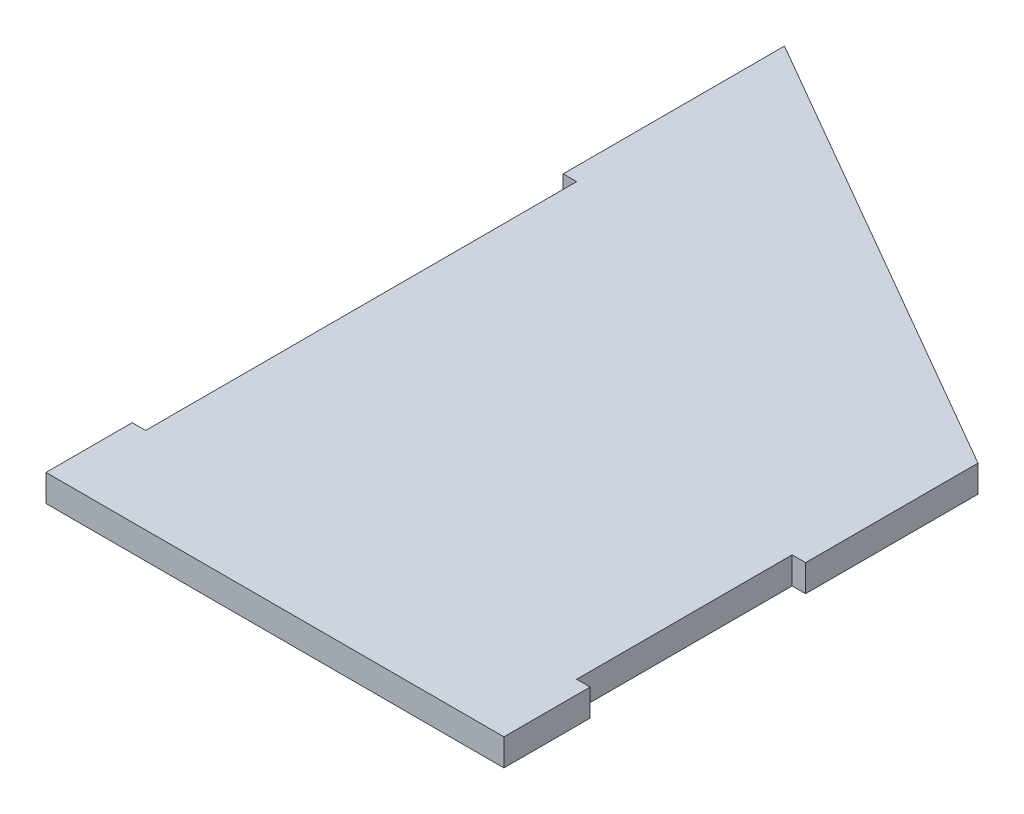
ISO-10303-21;
HEADER;
FILE_DESCRIPTION(('STEP AP214'),'2;1');
FILE_NAME('part.step','',(''),(''),'','','');
FILE_SCHEMA(('AUTOMOTIVE_DESIGN { 1 0 10303 214 1 1 1 1 }'));
ENDSEC;
DATA;
#1=APPLICATION_CONTEXT('core data for automotive mechanical design processes');
#2=APPLICATION_PROTOCOL_DEFINITION('international standard','automotive_design',2000,#1);
#3=PRODUCT_CONTEXT('',#1,'mechanical');
#4=PRODUCT('Part','Part','',(#3));
#5=PRODUCT_RELATED_PRODUCT_CATEGORY('part','',(#4));
#6=PRODUCT_DEFINITION_FORMATION('','',#4);
#7=PRODUCT_DEFINITION_CONTEXT('part definition',#1,'design');
#8=PRODUCT_DEFINITION('design','',#6,#7);
#9=PRODUCT_DEFINITION_SHAPE('','',#8);
#10=(LENGTH_UNIT() NAMED_UNIT(*) SI_UNIT(.MILLI.,.METRE.));
#11=(NAMED_UNIT(*) PLANE_ANGLE_UNIT() SI_UNIT($,.RADIAN.));
#12=(NAMED_UNIT(*) SI_UNIT($,.STERADIAN.) SOLID_ANGLE_UNIT());
#13=UNCERTAINTY_MEASURE_WITH_UNIT(LENGTH_MEASURE(1.E-05),#10,'distance_accuracy_value','');
#14=(GEOMETRIC_REPRESENTATION_CONTEXT(3) GLOBAL_UNCERTAINTY_ASSIGNED_CONTEXT((#13)) GLOBAL_UNIT_ASSIGNED_CONTEXT((#10,
#11,#12)) REPRESENTATION_CONTEXT('',''));
#15=CARTESIAN_POINT('',(0.,0.,0.));
#16=DIRECTION('',(0.,0.,1.));
#17=DIRECTION('',(1.,0.,0.));
#18=AXIS2_PLACEMENT_3D('',#15,#16,#17);
#19=CARTESIAN_POINT('',(0.,1.5875,-3.81));
#20=DIRECTION('',(0.,0.,1.));
#21=DIRECTION('',(1.,0.,0.));
#22=AXIS2_PLACEMENT_3D('',#19,#20,#21);
#23=PLANE('',#22);
#24=DIRECTION('',(-1.,0.,0.));
#25=VECTOR('',#24,1.);
#26=CARTESIAN_POINT('',(0.,0.,-3.81));
#27=LINE('',#26,#25);
#28=CARTESIAN_POINT('',(13.49375,0.,-3.81));
#29=VERTEX_POINT('',#28);
#30=CARTESIAN_POINT('',(12.7,0.,-3.81));
#31=VERTEX_POINT('',#30);
#32=EDGE_CURVE('E160',#29,#31,#27,.T.);
#33=ORIENTED_EDGE('',*,*,#32,.F.);
#34=DIRECTION('',(0.,-1.,0.));
#35=VECTOR('',#34,1.);
#36=CARTESIAN_POINT('',(13.49375,1.5875,-3.81));
#37=LINE('',#36,#35);
#38=CARTESIAN_POINT('',(13.49375,1.5875,-3.81));
#39=VERTEX_POINT('',#38);
#40=EDGE_CURVE('E11',#39,#29,#37,.T.);
#41=ORIENTED_EDGE('',*,*,#40,.F.);
#42=DIRECTION('',(-1.,0.,0.));
#43=VECTOR('',#42,1.);
#44=CARTESIAN_POINT('',(0.,1.5875,-3.81));
#45=LINE('',#44,#43);
#46=CARTESIAN_POINT('',(12.7,1.5875,-3.81));
#47=VERTEX_POINT('',#46);
#48=EDGE_CURVE('E189',#39,#47,#45,.T.);
#49=ORIENTED_EDGE('',*,*,#48,.T.);
#50=DIRECTION('',(0.,-1.,0.));
#51=VECTOR('',#50,1.);
#52=CARTESIAN_POINT('',(12.7,1.5875,-3.81));
#53=LINE('',#52,#51);
#54=EDGE_CURVE('E103',#47,#31,#53,.T.);
#55=ORIENTED_EDGE('',*,*,#54,.T.);
#56=EDGE_LOOP('',(#33,#41,#49,#55));
#57=FACE_BOUND('',#56,.T.);
#58=ADVANCED_FACE('F40',(#57),#23,.T.);
#59=CARTESIAN_POINT('',(13.49375,1.5875,0.));
#60=DIRECTION('',(-1.,0.,0.));
#61=DIRECTION('',(0.,0.,1.));
#62=AXIS2_PLACEMENT_3D('',#59,#60,#61);
#63=PLANE('',#62);
#64=DIRECTION('',(0.,0.,-1.));
#65=VECTOR('',#64,1.);
#66=CARTESIAN_POINT('',(13.49375,0.,0.));
#67=LINE('',#66,#65);
#68=CARTESIAN_POINT('',(13.49375,0.,-13.97));
#69=VERTEX_POINT('',#68);
#70=EDGE_CURVE('E163',#29,#69,#67,.T.);
#71=ORIENTED_EDGE('',*,*,#70,.T.);
#72=DIRECTION('',(0.,-1.,0.));
#73=VECTOR('',#72,1.);
#74=CARTESIAN_POINT('',(13.49375,1.5875,-13.97));
#75=LINE('',#74,#73);
#76=CARTESIAN_POINT('',(13.49375,1.5875,-13.97));
#77=VERTEX_POINT('',#76);
#78=EDGE_CURVE('E48',#77,#69,#75,.T.);
#79=ORIENTED_EDGE('',*,*,#78,.F.);
#80=DIRECTION('',(0.,0.,-1.));
#81=VECTOR('',#80,1.);
#82=CARTESIAN_POINT('',(13.49375,1.5875,0.));
#83=LINE('',#82,#81);
#84=EDGE_CURVE('E146',#39,#77,#83,.T.);
#85=ORIENTED_EDGE('',*,*,#84,.F.);
#86=ORIENTED_EDGE('',*,*,#40,.T.);
#87=EDGE_LOOP('',(#71,#79,#85,#86));
#88=FACE_BOUND('',#87,.T.);
#89=ADVANCED_FACE('F213',(#88),#63,.F.);
#90=CARTESIAN_POINT('',(9.42262494543433,1.5875,-16.3204651461581));
#91=DIRECTION('',(0.500000000000001,0.,-0.866025403784438));
#92=DIRECTION('',(-0.866025403784438,0.,-0.500000000000001));
#93=AXIS2_PLACEMENT_3D('',#90,#91,#92);
#94=PLANE('',#93);
#95=DIRECTION('',(0.866025403784438,0.,0.500000000000001));
#96=VECTOR('',#95,1.);
#97=CARTESIAN_POINT('',(9.42262494543433,0.,-16.3204651461581));
#98=LINE('',#97,#96);
#99=CARTESIAN_POINT('',(-13.49375,0.,-29.5512403897551));
#100=VERTEX_POINT('',#99);
#101=EDGE_CURVE('E166',#100,#69,#98,.T.);
#102=ORIENTED_EDGE('',*,*,#101,.F.);
#103=DIRECTION('',(0.,-1.,0.));
#104=VECTOR('',#103,1.);
#105=CARTESIAN_POINT('',(-13.49375,1.5875,-29.5512403897551));
#106=LINE('',#105,#104);
#107=CARTESIAN_POINT('',(-13.49375,1.5875,-29.5512403897551));
#108=VERTEX_POINT('',#107);
#109=EDGE_CURVE('E203',#108,#100,#106,.T.);
#110=ORIENTED_EDGE('',*,*,#109,.F.);
#111=DIRECTION('',(0.866025403784438,0.,0.500000000000001));
#112=VECTOR('',#111,1.);
#113=CARTESIAN_POINT('',(9.42262494543433,1.5875,-16.3204651461581));
#114=LINE('',#113,#112);
#115=EDGE_CURVE('E210',#108,#77,#114,.T.);
#116=ORIENTED_EDGE('',*,*,#115,.T.);
#117=ORIENTED_EDGE('',*,*,#78,.T.);
#118=EDGE_LOOP('',(#102,#110,#116,#117));
#119=FACE_BOUND('',#118,.T.);
#120=ADVANCED_FACE('F208',(#119),#94,.T.);
#121=CARTESIAN_POINT('',(-13.49375,1.5875,0.));
#122=DIRECTION('',(-1.,0.,0.));
#123=DIRECTION('',(0.,0.,1.));
#124=AXIS2_PLACEMENT_3D('',#121,#122,#123);
#125=PLANE('',#124);
#126=DIRECTION('',(0.,0.,-1.));
#127=VECTOR('',#126,1.);
#128=CARTESIAN_POINT('',(-13.49375,0.,0.));
#129=LINE('',#128,#127);
#130=CARTESIAN_POINT('',(-13.49375,0.,-16.51));
#131=VERTEX_POINT('',#130);
#132=EDGE_CURVE('E169',#131,#100,#129,.T.);
#133=ORIENTED_EDGE('',*,*,#132,.F.);
#134=DIRECTION('',(0.,-1.,0.));
#135=VECTOR('',#134,1.);
#136=CARTESIAN_POINT('',(-13.49375,1.5875,-16.51));
#137=LINE('',#136,#135);
#138=CARTESIAN_POINT('',(-13.49375,1.5875,-16.51));
#139=VERTEX_POINT('',#138);
#140=EDGE_CURVE('E201',#139,#131,#137,.T.);
#141=ORIENTED_EDGE('',*,*,#140,.F.);
#142=DIRECTION('',(0.,0.,-1.));
#143=VECTOR('',#142,1.);
#144=CARTESIAN_POINT('',(-13.49375,1.5875,0.));
#145=LINE('',#144,#143);
#146=EDGE_CURVE('E223',#139,#108,#145,.T.);
#147=ORIENTED_EDGE('',*,*,#146,.T.);
#148=ORIENTED_EDGE('',*,*,#109,.T.);
#149=EDGE_LOOP('',(#133,#141,#147,#148));
#150=FACE_BOUND('',#149,.T.);
#151=ADVANCED_FACE('F219',(#150),#125,.T.);
#152=CARTESIAN_POINT('',(0.,1.5875,-16.51));
#153=DIRECTION('',(0.,0.,-1.));
#154=DIRECTION('',(-1.,0.,0.));
#155=AXIS2_PLACEMENT_3D('',#152,#153,#154);
#156=PLANE('',#155);
#157=DIRECTION('',(1.,0.,0.));
#158=VECTOR('',#157,1.);
#159=CARTESIAN_POINT('',(0.,0.,-16.51));
#160=LINE('',#159,#158);
#161=CARTESIAN_POINT('',(-12.7,0.,-16.51));
#162=VERTEX_POINT('',#161);
#163=EDGE_CURVE('E172',#131,#162,#160,.T.);
#164=ORIENTED_EDGE('',*,*,#163,.T.);
#165=DIRECTION('',(0.,-1.,0.));
#166=VECTOR('',#165,1.);
#167=CARTESIAN_POINT('',(-12.7,1.5875,-16.51));
#168=LINE('',#167,#166);
#169=CARTESIAN_POINT('',(-12.7,1.5875,-16.51));
#170=VERTEX_POINT('',#169);
#171=EDGE_CURVE('E199',#170,#162,#168,.T.);
#172=ORIENTED_EDGE('',*,*,#171,.F.);
#173=DIRECTION('',(1.,0.,0.));
#174=VECTOR('',#173,1.);
#175=CARTESIAN_POINT('',(0.,1.5875,-16.51));
#176=LINE('',#175,#174);
#177=EDGE_CURVE('E225',#139,#170,#176,.T.);
#178=ORIENTED_EDGE('',*,*,#177,.F.);
#179=ORIENTED_EDGE('',*,*,#140,.T.);
#180=EDGE_LOOP('',(#164,#172,#178,#179));
#181=FACE_BOUND('',#180,.T.);
#182=ADVANCED_FACE('F326',(#181),#156,.F.);
#183=CARTESIAN_POINT('',(-12.7,1.5875,0.));
#184=DIRECTION('',(-1.,0.,0.));
#185=DIRECTION('',(0.,0.,1.));
#186=AXIS2_PLACEMENT_3D('',#183,#184,#185);
#187=PLANE('',#186);
#188=DIRECTION('',(0.,0.,-1.));
#189=VECTOR('',#188,1.);
#190=CARTESIAN_POINT('',(-12.7,0.,0.));
#191=LINE('',#190,#189);
#192=CARTESIAN_POINT('',(-12.7,0.,8.89));
#193=VERTEX_POINT('',#192);
#194=EDGE_CURVE('E175',#193,#162,#191,.T.);
#195=ORIENTED_EDGE('',*,*,#194,.F.);
#196=DIRECTION('',(0.,-1.,0.));
#197=VECTOR('',#196,1.);
#198=CARTESIAN_POINT('',(-12.7,1.5875,8.89));
#199=LINE('',#198,#197);
#200=CARTESIAN_POINT('',(-12.7,1.5875,8.89));
#201=VERTEX_POINT('',#200);
#202=EDGE_CURVE('E197',#201,#193,#199,.T.);
#203=ORIENTED_EDGE('',*,*,#202,.F.);
#204=DIRECTION('',(0.,0.,-1.));
#205=VECTOR('',#204,1.);
#206=CARTESIAN_POINT('',(-12.7,1.5875,0.));
#207=LINE('',#206,#205);
#208=EDGE_CURVE('E230',#201,#170,#207,.T.);
#209=ORIENTED_EDGE('',*,*,#208,.T.);
#210=ORIENTED_EDGE('',*,*,#171,.T.);
#211=EDGE_LOOP('',(#195,#203,#209,#210));
#212=FACE_BOUND('',#211,.T.);
#213=ADVANCED_FACE('F317',(#212),#187,.T.);
#214=CARTESIAN_POINT('',(0.,1.5875,8.89));
#215=DIRECTION('',(0.,0.,-1.));
#216=DIRECTION('',(-1.,0.,0.));
#217=AXIS2_PLACEMENT_3D('',#214,#215,#216);
#218=PLANE('',#217);
#219=DIRECTION('',(1.,0.,0.));
#220=VECTOR('',#219,1.);
#221=CARTESIAN_POINT('',(0.,0.,8.89));
#222=LINE('',#221,#220);
#223=CARTESIAN_POINT('',(-13.49375,0.,8.89));
#224=VERTEX_POINT('',#223);
#225=EDGE_CURVE('E178',#224,#193,#222,.T.);
#226=ORIENTED_EDGE('',*,*,#225,.F.);
#227=DIRECTION('',(0.,-1.,0.));
#228=VECTOR('',#227,1.);
#229=CARTESIAN_POINT('',(-13.49375,1.5875,8.89));
#230=LINE('',#229,#228);
#231=CARTESIAN_POINT('',(-13.49375,1.5875,8.89));
#232=VERTEX_POINT('',#231);
#233=EDGE_CURVE('E195',#232,#224,#230,.T.);
#234=ORIENTED_EDGE('',*,*,#233,.F.);
#235=DIRECTION('',(1.,0.,0.));
#236=VECTOR('',#235,1.);
#237=CARTESIAN_POINT('',(0.,1.5875,8.89));
#238=LINE('',#237,#236);
#239=EDGE_CURVE('E233',#232,#201,#238,.T.);
#240=ORIENTED_EDGE('',*,*,#239,.T.);
#241=ORIENTED_EDGE('',*,*,#202,.T.);
#242=EDGE_LOOP('',(#226,#234,#240,#241));
#243=FACE_BOUND('',#242,.T.);
#244=ADVANCED_FACE('F244',(#243),#218,.T.);
#245=CARTESIAN_POINT('',(-13.49375,1.5875,0.));
#246=DIRECTION('',(-1.,0.,0.));
#247=DIRECTION('',(0.,0.,1.));
#248=AXIS2_PLACEMENT_3D('',#245,#246,#247);
#249=PLANE('',#248);
#250=DIRECTION('',(0.,0.,-1.));
#251=VECTOR('',#250,1.);
#252=CARTESIAN_POINT('',(-13.49375,0.,0.));
#253=LINE('',#252,#251);
#254=CARTESIAN_POINT('',(-13.49375,0.,13.97));
#255=VERTEX_POINT('',#254);
#256=EDGE_CURVE('E181',#255,#224,#253,.T.);
#257=ORIENTED_EDGE('',*,*,#256,.F.);
#258=DIRECTION('',(0.,-1.,0.));
#259=VECTOR('',#258,1.);
#260=CARTESIAN_POINT('',(-13.49375,1.5875,13.97));
#261=LINE('',#260,#259);
#262=CARTESIAN_POINT('',(-13.49375,1.5875,13.97));
#263=VERTEX_POINT('',#262);
#264=EDGE_CURVE('E193',#263,#255,#261,.T.);
#265=ORIENTED_EDGE('',*,*,#264,.F.);
#266=DIRECTION('',(0.,0.,-1.));
#267=VECTOR('',#266,1.);
#268=CARTESIAN_POINT('',(-13.49375,1.5875,0.));
#269=LINE('',#268,#267);
#270=EDGE_CURVE('E235',#263,#232,#269,.T.);
#271=ORIENTED_EDGE('',*,*,#270,.T.);
#272=ORIENTED_EDGE('',*,*,#233,.T.);
#273=EDGE_LOOP('',(#257,#265,#271,#272));
#274=FACE_BOUND('',#273,.T.);
#275=ADVANCED_FACE('F239',(#274),#249,.T.);
#276=CARTESIAN_POINT('',(0.,1.5875,13.97));
#277=DIRECTION('',(0.,0.,-1.));
#278=DIRECTION('',(-1.,0.,0.));
#279=AXIS2_PLACEMENT_3D('',#276,#277,#278);
#280=PLANE('',#279);
#281=DIRECTION('',(1.,0.,0.));
#282=VECTOR('',#281,1.);
#283=CARTESIAN_POINT('',(0.,0.,13.97));
#284=LINE('',#283,#282);
#285=CARTESIAN_POINT('',(13.49375,0.,13.97));
#286=VERTEX_POINT('',#285);
#287=EDGE_CURVE('E184',#255,#286,#284,.T.);
#288=ORIENTED_EDGE('',*,*,#287,.T.);
#289=DIRECTION('',(0.,-1.,0.));
#290=VECTOR('',#289,1.);
#291=CARTESIAN_POINT('',(13.49375,1.5875,13.97));
#292=LINE('',#291,#290);
#293=CARTESIAN_POINT('',(13.49375,1.5875,13.97));
#294=VERTEX_POINT('',#293);
#295=EDGE_CURVE('E151',#294,#286,#292,.T.);
#296=ORIENTED_EDGE('',*,*,#295,.F.);
#297=DIRECTION('',(1.,0.,0.));
#298=VECTOR('',#297,1.);
#299=CARTESIAN_POINT('',(0.,1.5875,13.97));
#300=LINE('',#299,#298);
#301=EDGE_CURVE('E141',#263,#294,#300,.T.);
#302=ORIENTED_EDGE('',*,*,#301,.F.);
#303=ORIENTED_EDGE('',*,*,#264,.T.);
#304=EDGE_LOOP('',(#288,#296,#302,#303));
#305=FACE_BOUND('',#304,.T.);
#306=ADVANCED_FACE('F248',(#305),#280,.F.);
#307=CARTESIAN_POINT('',(13.49375,0.,8.89));
#308=VERTEX_POINT('',#307);
#309=EDGE_CURVE('E150',#286,#308,#67,.T.);
#310=ORIENTED_EDGE('',*,*,#309,.T.);
#311=DIRECTION('',(0.,-1.,0.));
#312=VECTOR('',#311,1.);
#313=CARTESIAN_POINT('',(13.49375,1.5875,8.89));
#314=LINE('',#313,#312);
#315=CARTESIAN_POINT('',(13.49375,1.5875,8.89));
#316=VERTEX_POINT('',#315);
#317=EDGE_CURVE('E147',#316,#308,#314,.T.);
#318=ORIENTED_EDGE('',*,*,#317,.F.);
#319=EDGE_CURVE('E134',#294,#316,#83,.T.);
#320=ORIENTED_EDGE('',*,*,#319,.F.);
#321=ORIENTED_EDGE('',*,*,#295,.T.);
#322=EDGE_LOOP('',(#310,#318,#320,#321));
#323=FACE_BOUND('',#322,.T.);
#324=ADVANCED_FACE('F148',(#323),#63,.F.);
#325=CARTESIAN_POINT('',(0.,1.5875,8.89));
#326=DIRECTION('',(0.,0.,1.));
#327=DIRECTION('',(1.,0.,0.));
#328=AXIS2_PLACEMENT_3D('',#325,#326,#327);
#329=PLANE('',#328);
#330=DIRECTION('',(-1.,0.,0.));
#331=VECTOR('',#330,1.);
#332=CARTESIAN_POINT('',(0.,0.,8.89));
#333=LINE('',#332,#331);
#334=CARTESIAN_POINT('',(12.7,0.,8.89));
#335=VERTEX_POINT('',#334);
#336=EDGE_CURVE('E96',#308,#335,#333,.T.);
#337=ORIENTED_EDGE('',*,*,#336,.T.);
#338=DIRECTION('',(0.,-1.,0.));
#339=VECTOR('',#338,1.);
#340=CARTESIAN_POINT('',(12.7,1.5875,8.89));
#341=LINE('',#340,#339);
#342=CARTESIAN_POINT('',(12.7,1.5875,8.89));
#343=VERTEX_POINT('',#342);
#344=EDGE_CURVE('E152',#343,#335,#341,.T.);
#345=ORIENTED_EDGE('',*,*,#344,.F.);
#346=DIRECTION('',(-1.,0.,0.));
#347=VECTOR('',#346,1.);
#348=CARTESIAN_POINT('',(0.,1.5875,8.89));
#349=LINE('',#348,#347);
#350=EDGE_CURVE('E138',#316,#343,#349,.T.);
#351=ORIENTED_EDGE('',*,*,#350,.F.);
#352=ORIENTED_EDGE('',*,*,#317,.T.);
#353=EDGE_LOOP('',(#337,#345,#351,#352));
#354=FACE_BOUND('',#353,.T.);
#355=ADVANCED_FACE('F154',(#354),#329,.F.);
#356=CARTESIAN_POINT('',(12.7,1.5875,0.));
#357=DIRECTION('',(-1.,0.,0.));
#358=DIRECTION('',(0.,0.,1.));
#359=AXIS2_PLACEMENT_3D('',#356,#357,#358);
#360=PLANE('',#359);
#361=DIRECTION('',(0.,0.,-1.));
#362=VECTOR('',#361,1.);
#363=CARTESIAN_POINT('',(12.7,0.,0.));
#364=LINE('',#363,#362);
#365=EDGE_CURVE('E187',#335,#31,#364,.T.);
#366=ORIENTED_EDGE('',*,*,#365,.T.);
#367=ORIENTED_EDGE('',*,*,#54,.F.);
#368=DIRECTION('',(0.,0.,-1.));
#369=VECTOR('',#368,1.);
#370=CARTESIAN_POINT('',(12.7,1.5875,0.));
#371=LINE('',#370,#369);
#372=EDGE_CURVE('E56',#343,#47,#371,.T.);
#373=ORIENTED_EDGE('',*,*,#372,.F.);
#374=ORIENTED_EDGE('',*,*,#344,.T.);
#375=EDGE_LOOP('',(#366,#367,#373,#374));
#376=FACE_BOUND('',#375,.T.);
#377=ADVANCED_FACE('F263',(#376),#360,.F.);
#378=CARTESIAN_POINT('',(0.,1.5875,0.));
#379=DIRECTION('',(0.,1.,0.));
#380=DIRECTION('',(0.,0.,1.));
#381=AXIS2_PLACEMENT_3D('',#378,#379,#380);
#382=PLANE('',#381);
#383=ORIENTED_EDGE('',*,*,#48,.F.);
#384=ORIENTED_EDGE('',*,*,#84,.T.);
#385=ORIENTED_EDGE('',*,*,#115,.F.);
#386=ORIENTED_EDGE('',*,*,#146,.F.);
#387=ORIENTED_EDGE('',*,*,#177,.T.);
#388=ORIENTED_EDGE('',*,*,#208,.F.);
#389=ORIENTED_EDGE('',*,*,#239,.F.);
#390=ORIENTED_EDGE('',*,*,#270,.F.);
#391=ORIENTED_EDGE('',*,*,#301,.T.);
#392=ORIENTED_EDGE('',*,*,#319,.T.);
#393=ORIENTED_EDGE('',*,*,#350,.T.);
#394=ORIENTED_EDGE('',*,*,#372,.T.);
#395=EDGE_LOOP('',(#383,#384,#385,#386,#387,#388,#389,#390,#391,#392,#393,#394));
#396=FACE_BOUND('',#395,.T.);
#397=ADVANCED_FACE('F136',(#396),#382,.T.);
#398=CARTESIAN_POINT('',(0.,0.,0.));
#399=DIRECTION('',(0.,1.,0.));
#400=DIRECTION('',(0.,0.,1.));
#401=AXIS2_PLACEMENT_3D('',#398,#399,#400);
#402=PLANE('',#401);
#403=ORIENTED_EDGE('',*,*,#32,.T.);
#404=ORIENTED_EDGE('',*,*,#365,.F.);
#405=ORIENTED_EDGE('',*,*,#336,.F.);
#406=ORIENTED_EDGE('',*,*,#309,.F.);
#407=ORIENTED_EDGE('',*,*,#287,.F.);
#408=ORIENTED_EDGE('',*,*,#256,.T.);
#409=ORIENTED_EDGE('',*,*,#225,.T.);
#410=ORIENTED_EDGE('',*,*,#194,.T.);
#411=ORIENTED_EDGE('',*,*,#163,.F.);
#412=ORIENTED_EDGE('',*,*,#132,.T.);
#413=ORIENTED_EDGE('',*,*,#101,.T.);
#414=ORIENTED_EDGE('',*,*,#70,.F.);
#415=EDGE_LOOP('',(#403,#404,#405,#406,#407,#408,#409,#410,#411,#412,#413,#414));
#416=FACE_BOUND('',#415,.T.);
#417=ADVANCED_FACE('F215',(#416),#402,.F.);
#418=CLOSED_SHELL('',(#58,#89,#120,#151,#182,#213,#244,#275,#306,#324,#355,#377,#397,#417));
#419=MANIFOLD_SOLID_BREP('B2',#418);
#420=ADVANCED_BREP_SHAPE_REPRESENTATION('',(#18,#419),#14);
#421=SHAPE_DEFINITION_REPRESENTATION(#9,#420);
ENDSEC;
END-ISO-10303-21;
